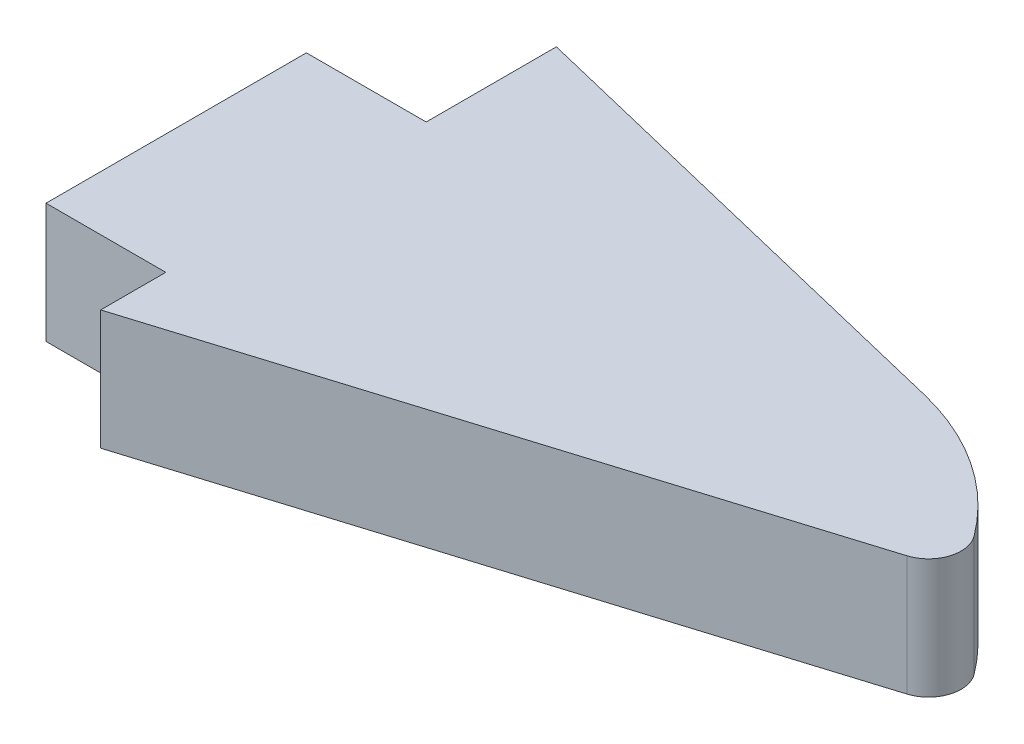
ISO-10303-21;
HEADER;
FILE_DESCRIPTION(('STEP AP214'),'2;1');
FILE_NAME('part.step','',(''),(''),'','','');
FILE_SCHEMA(('AUTOMOTIVE_DESIGN { 1 0 10303 214 1 1 1 1 }'));
ENDSEC;
DATA;
#1=APPLICATION_CONTEXT('core data for automotive mechanical design processes');
#2=APPLICATION_PROTOCOL_DEFINITION('international standard','automotive_design',2000,#1);
#3=PRODUCT_CONTEXT('',#1,'mechanical');
#4=PRODUCT('Part','Part','',(#3));
#5=PRODUCT_RELATED_PRODUCT_CATEGORY('part','',(#4));
#6=PRODUCT_DEFINITION_FORMATION('','',#4);
#7=PRODUCT_DEFINITION_CONTEXT('part definition',#1,'design');
#8=PRODUCT_DEFINITION('design','',#6,#7);
#9=PRODUCT_DEFINITION_SHAPE('','',#8);
#10=(LENGTH_UNIT() NAMED_UNIT(*) SI_UNIT(.MILLI.,.METRE.));
#11=(NAMED_UNIT(*) PLANE_ANGLE_UNIT() SI_UNIT($,.RADIAN.));
#12=(NAMED_UNIT(*) SI_UNIT($,.STERADIAN.) SOLID_ANGLE_UNIT());
#13=UNCERTAINTY_MEASURE_WITH_UNIT(LENGTH_MEASURE(1.E-05),#10,'distance_accuracy_value','');
#14=(GEOMETRIC_REPRESENTATION_CONTEXT(3) GLOBAL_UNCERTAINTY_ASSIGNED_CONTEXT((#13)) GLOBAL_UNIT_ASSIGNED_CONTEXT((#10,
#11,#12)) REPRESENTATION_CONTEXT('',''));
#15=CARTESIAN_POINT('',(0.,0.,0.));
#16=DIRECTION('',(0.,0.,1.));
#17=DIRECTION('',(1.,0.,0.));
#18=AXIS2_PLACEMENT_3D('',#15,#16,#17);
#19=CARTESIAN_POINT('',(3.06141846418517,5.842,-12.6660605064416));
#20=DIRECTION('',(-0.234937368511057,0.,0.97201051068242));
#21=DIRECTION('',(0.97201051068242,0.,0.234937368511057));
#22=AXIS2_PLACEMENT_3D('',#19,#20,#21);
#23=PLANE('',#22);
#24=DIRECTION('',(-0.97201051068242,0.,-0.234937368511057));
#25=VECTOR('',#24,1.);
#26=CARTESIAN_POINT('',(3.06141846418517,5.842,-12.6660605064416));
#27=LINE('',#26,#25);
#28=CARTESIAN_POINT('',(26.5685040542949,5.842,-6.98433919868817));
#29=VERTEX_POINT('',#28);
#30=CARTESIAN_POINT('',(2.921,5.842,-12.7));
#31=VERTEX_POINT('',#30);
#32=EDGE_CURVE('E106',#29,#31,#27,.T.);
#33=ORIENTED_EDGE('',*,*,#32,.F.);
#34=DIRECTION('',(0.,-1.,0.));
#35=VECTOR('',#34,1.);
#36=CARTESIAN_POINT('',(26.5685040542949,5.842,-6.98433919868817));
#37=LINE('',#36,#35);
#38=CARTESIAN_POINT('',(26.5685040542949,0.,-6.98433919868817));
#39=VERTEX_POINT('',#38);
#40=EDGE_CURVE('E125',#29,#39,#37,.T.);
#41=ORIENTED_EDGE('',*,*,#40,.T.);
#42=DIRECTION('',(-0.97201051068242,0.,-0.234937368511057));
#43=VECTOR('',#42,1.);
#44=CARTESIAN_POINT('',(3.06141846418517,0.,-12.6660605064416));
#45=LINE('',#44,#43);
#46=CARTESIAN_POINT('',(2.921,0.,-12.7));
#47=VERTEX_POINT('',#46);
#48=EDGE_CURVE('E121',#39,#47,#45,.T.);
#49=ORIENTED_EDGE('',*,*,#48,.T.);
#50=DIRECTION('',(0.,-1.,0.));
#51=VECTOR('',#50,1.);
#52=CARTESIAN_POINT('',(2.921,5.842,-12.7));
#53=LINE('',#52,#51);
#54=EDGE_CURVE('E119',#31,#47,#53,.T.);
#55=ORIENTED_EDGE('',*,*,#54,.F.);
#56=EDGE_LOOP('',(#33,#41,#49,#55));
#57=FACE_BOUND('',#56,.T.);
#58=ADVANCED_FACE('F35',(#57),#23,.F.);
#59=CARTESIAN_POINT('',(2.921,5.842,0.));
#60=DIRECTION('',(-1.,0.,0.));
#61=DIRECTION('',(0.,0.,1.));
#62=AXIS2_PLACEMENT_3D('',#59,#60,#61);
#63=PLANE('',#62);
#64=DIRECTION('',(0.,0.,-1.));
#65=VECTOR('',#64,1.);
#66=CARTESIAN_POINT('',(2.921,0.,0.));
#67=LINE('',#66,#65);
#68=CARTESIAN_POINT('',(2.921,0.,-6.35));
#69=VERTEX_POINT('',#68);
#70=EDGE_CURVE('E146',#69,#47,#67,.T.);
#71=ORIENTED_EDGE('',*,*,#70,.F.);
#72=DIRECTION('',(0.,-1.,0.));
#73=VECTOR('',#72,1.);
#74=CARTESIAN_POINT('',(2.921,5.842,-6.35));
#75=LINE('',#74,#73);
#76=CARTESIAN_POINT('',(2.921,5.842,-6.35));
#77=VERTEX_POINT('',#76);
#78=EDGE_CURVE('E126',#77,#69,#75,.T.);
#79=ORIENTED_EDGE('',*,*,#78,.F.);
#80=DIRECTION('',(0.,0.,-1.));
#81=VECTOR('',#80,1.);
#82=CARTESIAN_POINT('',(2.921,5.842,0.));
#83=LINE('',#82,#81);
#84=EDGE_CURVE('E110',#77,#31,#83,.T.);
#85=ORIENTED_EDGE('',*,*,#84,.T.);
#86=ORIENTED_EDGE('',*,*,#54,.T.);
#87=EDGE_LOOP('',(#71,#79,#85,#86));
#88=FACE_BOUND('',#87,.T.);
#89=ADVANCED_FACE('F128',(#88),#63,.T.);
#90=CARTESIAN_POINT('',(0.,5.842,-6.35));
#91=DIRECTION('',(0.,0.,1.));
#92=DIRECTION('',(1.,0.,0.));
#93=AXIS2_PLACEMENT_3D('',#90,#91,#92);
#94=PLANE('',#93);
#95=DIRECTION('',(-1.,0.,0.));
#96=VECTOR('',#95,1.);
#97=CARTESIAN_POINT('',(0.,0.,-6.35));
#98=LINE('',#97,#96);
#99=CARTESIAN_POINT('',(-2.921,0.,-6.35));
#100=VERTEX_POINT('',#99);
#101=EDGE_CURVE('E148',#69,#100,#98,.T.);
#102=ORIENTED_EDGE('',*,*,#101,.T.);
#103=DIRECTION('',(0.,-1.,0.));
#104=VECTOR('',#103,1.);
#105=CARTESIAN_POINT('',(-2.921,5.842,-6.35));
#106=LINE('',#105,#104);
#107=CARTESIAN_POINT('',(-2.921,5.842,-6.35));
#108=VERTEX_POINT('',#107);
#109=EDGE_CURVE('E166',#108,#100,#106,.T.);
#110=ORIENTED_EDGE('',*,*,#109,.F.);
#111=DIRECTION('',(-1.,0.,0.));
#112=VECTOR('',#111,1.);
#113=CARTESIAN_POINT('',(0.,5.842,-6.35));
#114=LINE('',#113,#112);
#115=EDGE_CURVE('E130',#77,#108,#114,.T.);
#116=ORIENTED_EDGE('',*,*,#115,.F.);
#117=ORIENTED_EDGE('',*,*,#78,.T.);
#118=EDGE_LOOP('',(#102,#110,#116,#117));
#119=FACE_BOUND('',#118,.T.);
#120=ADVANCED_FACE('F186',(#119),#94,.F.);
#121=CARTESIAN_POINT('',(-2.921,5.842,0.));
#122=DIRECTION('',(-1.,0.,0.));
#123=DIRECTION('',(0.,0.,1.));
#124=AXIS2_PLACEMENT_3D('',#121,#122,#123);
#125=PLANE('',#124);
#126=DIRECTION('',(0.,0.,-1.));
#127=VECTOR('',#126,1.);
#128=CARTESIAN_POINT('',(-2.921,0.,0.));
#129=LINE('',#128,#127);
#130=CARTESIAN_POINT('',(-2.921,0.,6.35));
#131=VERTEX_POINT('',#130);
#132=EDGE_CURVE('E151',#131,#100,#129,.T.);
#133=ORIENTED_EDGE('',*,*,#132,.F.);
#134=DIRECTION('',(0.,-1.,0.));
#135=VECTOR('',#134,1.);
#136=CARTESIAN_POINT('',(-2.921,5.842,6.35));
#137=LINE('',#136,#135);
#138=CARTESIAN_POINT('',(-2.921,5.842,6.35));
#139=VERTEX_POINT('',#138);
#140=EDGE_CURVE('E164',#139,#131,#137,.T.);
#141=ORIENTED_EDGE('',*,*,#140,.F.);
#142=DIRECTION('',(0.,0.,-1.));
#143=VECTOR('',#142,1.);
#144=CARTESIAN_POINT('',(-2.921,5.842,0.));
#145=LINE('',#144,#143);
#146=EDGE_CURVE('E132',#139,#108,#145,.T.);
#147=ORIENTED_EDGE('',*,*,#146,.T.);
#148=ORIENTED_EDGE('',*,*,#109,.T.);
#149=EDGE_LOOP('',(#133,#141,#147,#148));
#150=FACE_BOUND('',#149,.T.);
#151=ADVANCED_FACE('F211',(#150),#125,.T.);
#152=CARTESIAN_POINT('',(0.,5.842,6.35));
#153=DIRECTION('',(0.,0.,1.));
#154=DIRECTION('',(1.,0.,0.));
#155=AXIS2_PLACEMENT_3D('',#152,#153,#154);
#156=PLANE('',#155);
#157=DIRECTION('',(-1.,0.,0.));
#158=VECTOR('',#157,1.);
#159=CARTESIAN_POINT('',(0.,0.,6.35));
#160=LINE('',#159,#158);
#161=CARTESIAN_POINT('',(2.921,0.,6.35));
#162=VERTEX_POINT('',#161);
#163=EDGE_CURVE('E154',#162,#131,#160,.T.);
#164=ORIENTED_EDGE('',*,*,#163,.F.);
#165=DIRECTION('',(0.,-1.,0.));
#166=VECTOR('',#165,1.);
#167=CARTESIAN_POINT('',(2.921,5.842,6.35));
#168=LINE('',#167,#166);
#169=CARTESIAN_POINT('',(2.921,5.842,6.35));
#170=VERTEX_POINT('',#169);
#171=EDGE_CURVE('E162',#170,#162,#168,.T.);
#172=ORIENTED_EDGE('',*,*,#171,.F.);
#173=DIRECTION('',(-1.,0.,0.));
#174=VECTOR('',#173,1.);
#175=CARTESIAN_POINT('',(0.,5.842,6.35));
#176=LINE('',#175,#174);
#177=EDGE_CURVE('E137',#170,#139,#176,.T.);
#178=ORIENTED_EDGE('',*,*,#177,.T.);
#179=ORIENTED_EDGE('',*,*,#140,.T.);
#180=EDGE_LOOP('',(#164,#172,#178,#179));
#181=FACE_BOUND('',#180,.T.);
#182=ADVANCED_FACE('F192',(#181),#156,.T.);
#183=CARTESIAN_POINT('',(2.921,5.842,0.));
#184=DIRECTION('',(1.,0.,0.));
#185=DIRECTION('',(0.,0.,-1.));
#186=AXIS2_PLACEMENT_3D('',#183,#184,#185);
#187=PLANE('',#186);
#188=DIRECTION('',(0.,0.,1.));
#189=VECTOR('',#188,1.);
#190=CARTESIAN_POINT('',(2.921,0.,0.));
#191=LINE('',#190,#189);
#192=CARTESIAN_POINT('',(2.921,0.,9.525));
#193=VERTEX_POINT('',#192);
#194=EDGE_CURVE('E157',#162,#193,#191,.T.);
#195=ORIENTED_EDGE('',*,*,#194,.T.);
#196=DIRECTION('',(0.,-1.,0.));
#197=VECTOR('',#196,1.);
#198=CARTESIAN_POINT('',(2.921,5.842,9.525));
#199=LINE('',#198,#197);
#200=CARTESIAN_POINT('',(2.921,5.842,9.525));
#201=VERTEX_POINT('',#200);
#202=EDGE_CURVE('E144',#201,#193,#199,.T.);
#203=ORIENTED_EDGE('',*,*,#202,.F.);
#204=DIRECTION('',(0.,0.,1.));
#205=VECTOR('',#204,1.);
#206=CARTESIAN_POINT('',(2.921,5.842,0.));
#207=LINE('',#206,#205);
#208=EDGE_CURVE('E140',#170,#201,#207,.T.);
#209=ORIENTED_EDGE('',*,*,#208,.F.);
#210=ORIENTED_EDGE('',*,*,#171,.T.);
#211=EDGE_LOOP('',(#195,#203,#209,#210));
#212=FACE_BOUND('',#211,.T.);
#213=ADVANCED_FACE('F197',(#212),#187,.F.);
#214=CARTESIAN_POINT('',(2.9394084136925,5.842,9.5193157841049));
#215=DIRECTION('',(-0.295038219216782,0.,-0.955485452113945));
#216=DIRECTION('',(-0.955485452113945,0.,0.295038219216782));
#217=AXIS2_PLACEMENT_3D('',#214,#215,#216);
#218=PLANE('',#217);
#219=DIRECTION('',(0.955485452113945,0.,-0.295038219216782));
#220=VECTOR('',#219,1.);
#221=CARTESIAN_POINT('',(2.9394084136925,0.,9.5193157841049));
#222=LINE('',#221,#220);
#223=CARTESIAN_POINT('',(32.970552891481,0.,0.246191459536967));
#224=VERTEX_POINT('',#223);
#225=EDGE_CURVE('E116',#193,#224,#222,.T.);
#226=ORIENTED_EDGE('',*,*,#225,.T.);
#227=DIRECTION('',(0.,1.,0.));
#228=VECTOR('',#227,1.);
#229=CARTESIAN_POINT('',(32.970552891481,5.842,0.246191459536964));
#230=LINE('',#229,#228);
#231=CARTESIAN_POINT('',(32.970552891481,5.842,0.246191459536967));
#232=VERTEX_POINT('',#231);
#233=EDGE_CURVE('E43',#224,#232,#230,.T.);
#234=ORIENTED_EDGE('',*,*,#233,.T.);
#235=DIRECTION('',(0.955485452113945,0.,-0.295038219216782));
#236=VECTOR('',#235,1.);
#237=CARTESIAN_POINT('',(2.9394084136925,5.842,9.5193157841049));
#238=LINE('',#237,#236);
#239=EDGE_CURVE('E142',#201,#232,#238,.T.);
#240=ORIENTED_EDGE('',*,*,#239,.F.);
#241=ORIENTED_EDGE('',*,*,#202,.T.);
#242=EDGE_LOOP('',(#226,#234,#240,#241));
#243=FACE_BOUND('',#242,.T.);
#244=ADVANCED_FACE('F218',(#243),#218,.F.);
#245=CARTESIAN_POINT('',(0.,5.842,0.));
#246=DIRECTION('',(0.,1.,0.));
#247=DIRECTION('',(0.,0.,1.));
#248=AXIS2_PLACEMENT_3D('',#245,#246,#247);
#249=PLANE('',#248);
#250=ORIENTED_EDGE('',*,*,#239,.T.);
#251=CARTESIAN_POINT('',(32.5021797184744,5.842,-1.27064169569392));
#252=DIRECTION('',(0.,1.,0.));
#253=DIRECTION('',(0.,0.,1.));
#254=AXIS2_PLACEMENT_3D('',#251,#252,#253);
#255=CIRCLE('',#254,1.5875);
#256=CARTESIAN_POINT('',(33.7760911819415,5.842,-2.21790397893285));
#257=VERTEX_POINT('',#256);
#258=EDGE_CURVE('E11',#232,#257,#255,.T.);
#259=ORIENTED_EDGE('',*,*,#258,.T.);
#260=CARTESIAN_POINT('',(23.5847994742044,5.842,5.36019428697857));
#261=DIRECTION('',(0.,1.,0.));
#262=DIRECTION('',(0.,0.,1.));
#263=AXIS2_PLACEMENT_3D('',#260,#261,#262);
#264=CIRCLE('',#263,12.7);
#265=EDGE_CURVE('E112',#257,#29,#264,.T.);
#266=ORIENTED_EDGE('',*,*,#265,.T.);
#267=ORIENTED_EDGE('',*,*,#32,.T.);
#268=ORIENTED_EDGE('',*,*,#84,.F.);
#269=ORIENTED_EDGE('',*,*,#115,.T.);
#270=ORIENTED_EDGE('',*,*,#146,.F.);
#271=ORIENTED_EDGE('',*,*,#177,.F.);
#272=ORIENTED_EDGE('',*,*,#208,.T.);
#273=EDGE_LOOP('',(#250,#259,#266,#267,#268,#269,#270,#271,#272));
#274=FACE_BOUND('',#273,.T.);
#275=ADVANCED_FACE('F108',(#274),#249,.T.);
#276=CARTESIAN_POINT('',(0.,0.,0.));
#277=DIRECTION('',(0.,1.,0.));
#278=DIRECTION('',(0.,0.,1.));
#279=AXIS2_PLACEMENT_3D('',#276,#277,#278);
#280=PLANE('',#279);
#281=CARTESIAN_POINT('',(23.5847994742044,0.,5.36019428697857));
#282=DIRECTION('',(0.,1.,0.));
#283=DIRECTION('',(0.,0.,1.));
#284=AXIS2_PLACEMENT_3D('',#281,#282,#283);
#285=CIRCLE('',#284,12.7);
#286=CARTESIAN_POINT('',(33.7760911819415,0.,-2.21790397893285));
#287=VERTEX_POINT('',#286);
#288=EDGE_CURVE('E170',#39,#287,#285,.F.);
#289=ORIENTED_EDGE('',*,*,#288,.T.);
#290=CARTESIAN_POINT('',(32.5021797184744,0.,-1.27064169569392));
#291=DIRECTION('',(0.,1.,0.));
#292=DIRECTION('',(0.,0.,1.));
#293=AXIS2_PLACEMENT_3D('',#290,#291,#292);
#294=CIRCLE('',#293,1.5875);
#295=EDGE_CURVE('E57',#287,#224,#294,.F.);
#296=ORIENTED_EDGE('',*,*,#295,.T.);
#297=ORIENTED_EDGE('',*,*,#225,.F.);
#298=ORIENTED_EDGE('',*,*,#194,.F.);
#299=ORIENTED_EDGE('',*,*,#163,.T.);
#300=ORIENTED_EDGE('',*,*,#132,.T.);
#301=ORIENTED_EDGE('',*,*,#101,.F.);
#302=ORIENTED_EDGE('',*,*,#70,.T.);
#303=ORIENTED_EDGE('',*,*,#48,.F.);
#304=EDGE_LOOP('',(#289,#296,#297,#298,#299,#300,#301,#302,#303));
#305=FACE_BOUND('',#304,.T.);
#306=ADVANCED_FACE('F181',(#305),#280,.F.);
#307=CARTESIAN_POINT('',(23.5847994742044,5.842,5.36019428697857));
#308=DIRECTION('',(0.,-1.,0.));
#309=DIRECTION('',(0.,0.,-1.));
#310=AXIS2_PLACEMENT_3D('',#307,#308,#309);
#311=CYLINDRICAL_SURFACE('',#310,12.7);
#312=ORIENTED_EDGE('',*,*,#265,.F.);
#313=DIRECTION('',(0.,-1.,0.));
#314=VECTOR('',#313,1.);
#315=CARTESIAN_POINT('',(33.7760911819415,5.842,-2.21790397893285));
#316=LINE('',#315,#314);
#317=EDGE_CURVE('E173',#257,#287,#316,.T.);
#318=ORIENTED_EDGE('',*,*,#317,.T.);
#319=ORIENTED_EDGE('',*,*,#288,.F.);
#320=ORIENTED_EDGE('',*,*,#40,.F.);
#321=EDGE_LOOP('',(#312,#318,#319,#320));
#322=FACE_BOUND('',#321,.T.);
#323=ADVANCED_FACE('F178',(#322),#311,.T.);
#324=CARTESIAN_POINT('',(32.5021797184744,5.842,-1.27064169569392));
#325=DIRECTION('',(0.,-1.,0.));
#326=DIRECTION('',(0.,0.,-1.));
#327=AXIS2_PLACEMENT_3D('',#324,#325,#326);
#328=CYLINDRICAL_SURFACE('',#327,1.5875);
#329=ORIENTED_EDGE('',*,*,#258,.F.);
#330=ORIENTED_EDGE('',*,*,#233,.F.);
#331=ORIENTED_EDGE('',*,*,#295,.F.);
#332=ORIENTED_EDGE('',*,*,#317,.F.);
#333=EDGE_LOOP('',(#329,#330,#331,#332));
#334=FACE_BOUND('',#333,.T.);
#335=ADVANCED_FACE('F37',(#334),#328,.T.);
#336=CLOSED_SHELL('',(#58,#89,#120,#151,#182,#213,#244,#275,#306,#323,#335));
#337=MANIFOLD_SOLID_BREP('B2',#336);
#338=ADVANCED_BREP_SHAPE_REPRESENTATION('',(#18,#337),#14);
#339=SHAPE_DEFINITION_REPRESENTATION(#9,#338);
ENDSEC;
END-ISO-10303-21;
